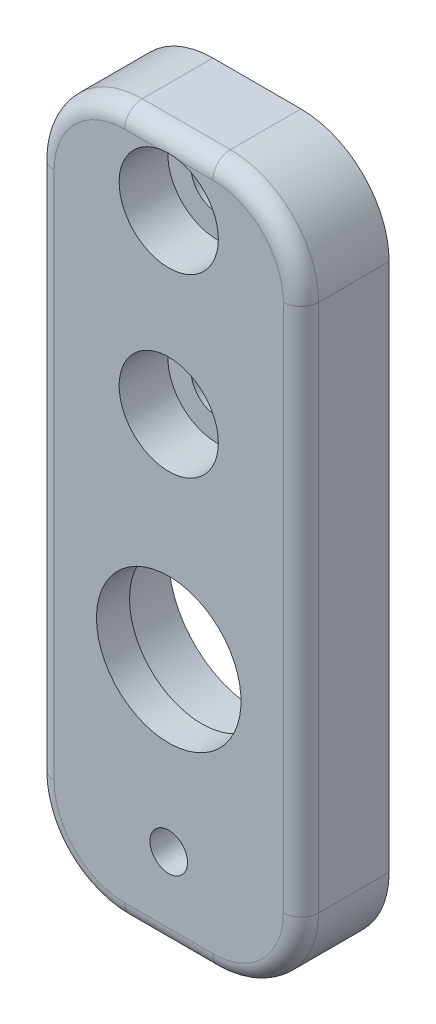
ISO-10303-21;
HEADER;
FILE_DESCRIPTION(('STEP AP214'),'2;1');
FILE_NAME('part.step','',(''),(''),'','','');
FILE_SCHEMA(('AUTOMOTIVE_DESIGN { 1 0 10303 214 1 1 1 1 }'));
ENDSEC;
DATA;
#1=APPLICATION_CONTEXT('core data for automotive mechanical design processes');
#2=APPLICATION_PROTOCOL_DEFINITION('international standard','automotive_design',2000,#1);
#3=PRODUCT_CONTEXT('',#1,'mechanical');
#4=PRODUCT('Part','Part','',(#3));
#5=PRODUCT_RELATED_PRODUCT_CATEGORY('part','',(#4));
#6=PRODUCT_DEFINITION_FORMATION('','',#4);
#7=PRODUCT_DEFINITION_CONTEXT('part definition',#1,'design');
#8=PRODUCT_DEFINITION('design','',#6,#7);
#9=PRODUCT_DEFINITION_SHAPE('','',#8);
#10=(LENGTH_UNIT() NAMED_UNIT(*) SI_UNIT(.MILLI.,.METRE.));
#11=(NAMED_UNIT(*) PLANE_ANGLE_UNIT() SI_UNIT($,.RADIAN.));
#12=(NAMED_UNIT(*) SI_UNIT($,.STERADIAN.) SOLID_ANGLE_UNIT());
#13=UNCERTAINTY_MEASURE_WITH_UNIT(LENGTH_MEASURE(1.E-05),#10,'distance_accuracy_value','');
#14=(GEOMETRIC_REPRESENTATION_CONTEXT(3) GLOBAL_UNCERTAINTY_ASSIGNED_CONTEXT((#13)) GLOBAL_UNIT_ASSIGNED_CONTEXT((#10,
#11,#12)) REPRESENTATION_CONTEXT('',''));
#15=CARTESIAN_POINT('',(0.,0.,0.));
#16=DIRECTION('',(0.,0.,1.));
#17=DIRECTION('',(1.,0.,0.));
#18=AXIS2_PLACEMENT_3D('',#15,#16,#17);
#19=CARTESIAN_POINT('',(9.525,18.034,0.));
#20=DIRECTION('',(0.,0.,-1.));
#21=DIRECTION('',(-1.,0.,0.));
#22=AXIS2_PLACEMENT_3D('',#19,#20,#21);
#23=CYLINDRICAL_SURFACE('',#22,5.207);
#24=CARTESIAN_POINT('',(9.525,18.034,0.));
#25=DIRECTION('',(0.,0.,-1.));
#26=DIRECTION('',(-1.,0.,0.));
#27=AXIS2_PLACEMENT_3D('',#24,#25,#26);
#28=CIRCLE('',#27,5.207);
#29=CARTESIAN_POINT('',(4.318,18.034,0.));
#30=VERTEX_POINT('',#29);
#31=EDGE_CURVE('E172',#30,#30,#28,.T.);
#32=ORIENTED_EDGE('',*,*,#31,.F.);
#33=EDGE_LOOP('',(#32));
#34=FACE_BOUND('',#33,.T.);
#35=CARTESIAN_POINT('',(9.525,18.034,-2.38252000000001));
#36=DIRECTION('',(0.,0.,-1.));
#37=DIRECTION('',(-1.,0.,0.));
#38=AXIS2_PLACEMENT_3D('',#35,#36,#37);
#39=CIRCLE('',#38,5.207);
#40=CARTESIAN_POINT('',(4.318,18.034,-2.38252000000001));
#41=VERTEX_POINT('',#40);
#42=EDGE_CURVE('E375',#41,#41,#39,.T.);
#43=ORIENTED_EDGE('',*,*,#42,.T.);
#44=EDGE_LOOP('',(#43));
#45=FACE_BOUND('',#44,.T.);
#46=ADVANCED_FACE('F34',(#34,#45),#23,.F.);
#47=CARTESIAN_POINT('',(19.05,0.,0.));
#48=DIRECTION('',(0.,1.,0.));
#49=DIRECTION('',(0.,0.,1.));
#50=AXIS2_PLACEMENT_3D('',#47,#48,#49);
#51=PLANE('',#50);
#52=DIRECTION('',(0.,0.,-1.));
#53=VECTOR('',#52,1.);
#54=CARTESIAN_POINT('',(12.7,0.,0.));
#55=LINE('',#54,#53);
#56=CARTESIAN_POINT('',(12.7,0.,-6.35000000000001));
#57=VERTEX_POINT('',#56);
#58=CARTESIAN_POINT('',(12.7,0.,-1.27));
#59=VERTEX_POINT('',#58);
#60=EDGE_CURVE('E209',#57,#59,#55,.F.);
#61=ORIENTED_EDGE('',*,*,#60,.T.);
#62=DIRECTION('',(-1.,0.,0.));
#63=VECTOR('',#62,1.);
#64=CARTESIAN_POINT('',(19.05,0.,-1.27));
#65=LINE('',#64,#63);
#66=CARTESIAN_POINT('',(6.35,0.,-1.27));
#67=VERTEX_POINT('',#66);
#68=EDGE_CURVE('E357',#59,#67,#65,.T.);
#69=ORIENTED_EDGE('',*,*,#68,.T.);
#70=DIRECTION('',(0.,0.,-1.));
#71=VECTOR('',#70,1.);
#72=CARTESIAN_POINT('',(6.35,0.,-6.35000000000001));
#73=LINE('',#72,#71);
#74=CARTESIAN_POINT('',(6.35,0.,-6.35000000000001));
#75=VERTEX_POINT('',#74);
#76=EDGE_CURVE('E211',#67,#75,#73,.T.);
#77=ORIENTED_EDGE('',*,*,#76,.T.);
#78=DIRECTION('',(-1.,0.,0.));
#79=VECTOR('',#78,1.);
#80=CARTESIAN_POINT('',(19.05,0.,-6.35000000000001));
#81=LINE('',#80,#79);
#82=EDGE_CURVE('E184',#57,#75,#81,.T.);
#83=ORIENTED_EDGE('',*,*,#82,.F.);
#84=EDGE_LOOP('',(#61,#69,#77,#83));
#85=FACE_BOUND('',#84,.T.);
#86=ADVANCED_FACE('F276',(#85),#51,.F.);
#87=CARTESIAN_POINT('',(19.05,50.8,-6.35));
#88=DIRECTION('',(0.,0.,1.));
#89=DIRECTION('',(0.,-1.,0.));
#90=AXIS2_PLACEMENT_3D('',#87,#88,#89);
#91=PLANE('',#90);
#92=CARTESIAN_POINT('',(9.525,18.034,-6.35000000000001));
#93=DIRECTION('',(0.,0.,-1.));
#94=DIRECTION('',(-1.,0.,0.));
#95=AXIS2_PLACEMENT_3D('',#92,#93,#94);
#96=CIRCLE('',#95,6.35);
#97=CARTESIAN_POINT('',(3.175,18.034,-6.35000000000001));
#98=VERTEX_POINT('',#97);
#99=EDGE_CURVE('E381',#98,#98,#96,.T.);
#100=ORIENTED_EDGE('',*,*,#99,.F.);
#101=EDGE_LOOP('',(#100));
#102=FACE_BOUND('',#101,.T.);
#103=CARTESIAN_POINT('',(9.52499999999999,46.0375,-6.35000000000001));
#104=DIRECTION('',(0.,0.,1.));
#105=DIRECTION('',(1.,0.,0.));
#106=AXIS2_PLACEMENT_3D('',#103,#104,#105);
#107=CIRCLE('',#106,1.89865000000001);
#108=CARTESIAN_POINT('',(11.42365,46.0375,-6.35000000000001));
#109=VERTEX_POINT('',#108);
#110=EDGE_CURVE('E157',#109,#109,#107,.T.);
#111=ORIENTED_EDGE('',*,*,#110,.T.);
#112=EDGE_LOOP('',(#111));
#113=FACE_BOUND('',#112,.T.);
#114=CARTESIAN_POINT('',(9.525,33.3375,-6.35000000000001));
#115=DIRECTION('',(0.,0.,1.));
#116=DIRECTION('',(1.,0.,0.));
#117=AXIS2_PLACEMENT_3D('',#114,#115,#116);
#118=CIRCLE('',#117,1.89865000000001);
#119=CARTESIAN_POINT('',(11.42365,33.3375,-6.35000000000001));
#120=VERTEX_POINT('',#119);
#121=EDGE_CURVE('E169',#120,#120,#118,.T.);
#122=ORIENTED_EDGE('',*,*,#121,.T.);
#123=EDGE_LOOP('',(#122));
#124=FACE_BOUND('',#123,.T.);
#125=DIRECTION('',(0.,1.,0.));
#126=VECTOR('',#125,1.);
#127=CARTESIAN_POINT('',(0.,50.8,-6.35));
#128=LINE('',#127,#126);
#129=CARTESIAN_POINT('',(0.,6.35,-6.35));
#130=VERTEX_POINT('',#129);
#131=CARTESIAN_POINT('',(0.,44.45,-6.35));
#132=VERTEX_POINT('',#131);
#133=EDGE_CURVE('E175',#130,#132,#128,.T.);
#134=ORIENTED_EDGE('',*,*,#133,.T.);
#135=CARTESIAN_POINT('',(6.35,44.45,-6.35));
#136=DIRECTION('',(0.,0.,1.));
#137=DIRECTION('',(0.,-1.,0.));
#138=AXIS2_PLACEMENT_3D('',#135,#136,#137);
#139=CIRCLE('',#138,6.35);
#140=CARTESIAN_POINT('',(6.35,50.8,-6.35));
#141=VERTEX_POINT('',#140);
#142=EDGE_CURVE('E203',#132,#141,#139,.F.);
#143=ORIENTED_EDGE('',*,*,#142,.T.);
#144=DIRECTION('',(-1.,0.,0.));
#145=VECTOR('',#144,1.);
#146=CARTESIAN_POINT('',(19.05,50.8,-6.35));
#147=LINE('',#146,#145);
#148=CARTESIAN_POINT('',(12.7,50.8,-6.35));
#149=VERTEX_POINT('',#148);
#150=EDGE_CURVE('E179',#149,#141,#147,.T.);
#151=ORIENTED_EDGE('',*,*,#150,.F.);
#152=CARTESIAN_POINT('',(12.7,44.45,-6.35));
#153=DIRECTION('',(0.,0.,1.));
#154=DIRECTION('',(0.,-1.,0.));
#155=AXIS2_PLACEMENT_3D('',#152,#153,#154);
#156=CIRCLE('',#155,6.35);
#157=CARTESIAN_POINT('',(19.05,44.45,-6.35));
#158=VERTEX_POINT('',#157);
#159=EDGE_CURVE('E201',#149,#158,#156,.F.);
#160=ORIENTED_EDGE('',*,*,#159,.T.);
#161=DIRECTION('',(0.,1.,0.));
#162=VECTOR('',#161,1.);
#163=CARTESIAN_POINT('',(19.05,50.8,-6.35));
#164=LINE('',#163,#162);
#165=CARTESIAN_POINT('',(19.05,6.35,-6.35));
#166=VERTEX_POINT('',#165);
#167=EDGE_CURVE('E176',#166,#158,#164,.T.);
#168=ORIENTED_EDGE('',*,*,#167,.F.);
#169=CARTESIAN_POINT('',(12.7,6.35,-6.35));
#170=DIRECTION('',(0.,0.,1.));
#171=DIRECTION('',(0.,-1.,0.));
#172=AXIS2_PLACEMENT_3D('',#169,#170,#171);
#173=CIRCLE('',#172,6.35);
#174=EDGE_CURVE('E197',#166,#57,#173,.F.);
#175=ORIENTED_EDGE('',*,*,#174,.T.);
#176=ORIENTED_EDGE('',*,*,#82,.T.);
#177=CARTESIAN_POINT('',(6.35,6.35,-6.35));
#178=DIRECTION('',(0.,0.,1.));
#179=DIRECTION('',(0.,-1.,0.));
#180=AXIS2_PLACEMENT_3D('',#177,#178,#179);
#181=CIRCLE('',#180,6.35);
#182=EDGE_CURVE('E199',#75,#130,#181,.F.);
#183=ORIENTED_EDGE('',*,*,#182,.T.);
#184=EDGE_LOOP('',(#134,#143,#151,#160,#168,#175,#176,#183));
#185=FACE_BOUND('',#184,.T.);
#186=ADVANCED_FACE('F291',(#102,#113,#124,#185),#91,.F.);
#187=CARTESIAN_POINT('',(19.05,50.8,0.));
#188=DIRECTION('',(0.,-1.,0.));
#189=DIRECTION('',(0.,0.,-1.));
#190=AXIS2_PLACEMENT_3D('',#187,#188,#189);
#191=PLANE('',#190);
#192=DIRECTION('',(0.,0.,1.));
#193=VECTOR('',#192,1.);
#194=CARTESIAN_POINT('',(6.35,50.8,0.));
#195=LINE('',#194,#193);
#196=CARTESIAN_POINT('',(6.35,50.8,-1.27));
#197=VERTEX_POINT('',#196);
#198=EDGE_CURVE('E189',#141,#197,#195,.T.);
#199=ORIENTED_EDGE('',*,*,#198,.T.);
#200=DIRECTION('',(-1.,0.,0.));
#201=VECTOR('',#200,1.);
#202=CARTESIAN_POINT('',(19.05,50.8,-1.27));
#203=LINE('',#202,#201);
#204=CARTESIAN_POINT('',(12.7,50.8,-1.27));
#205=VERTEX_POINT('',#204);
#206=EDGE_CURVE('E242',#197,#205,#203,.F.);
#207=ORIENTED_EDGE('',*,*,#206,.T.);
#208=DIRECTION('',(0.,0.,1.));
#209=VECTOR('',#208,1.);
#210=CARTESIAN_POINT('',(12.7,50.8,0.));
#211=LINE('',#210,#209);
#212=EDGE_CURVE('E187',#205,#149,#211,.F.);
#213=ORIENTED_EDGE('',*,*,#212,.T.);
#214=ORIENTED_EDGE('',*,*,#150,.T.);
#215=EDGE_LOOP('',(#199,#207,#213,#214));
#216=FACE_BOUND('',#215,.T.);
#217=ADVANCED_FACE('F287',(#216),#191,.F.);
#218=CARTESIAN_POINT('',(19.05,0.,0.));
#219=DIRECTION('',(0.,0.,-1.));
#220=DIRECTION('',(-1.,0.,0.));
#221=AXIS2_PLACEMENT_3D('',#218,#219,#220);
#222=PLANE('',#221);
#223=CARTESIAN_POINT('',(9.525,6.034,0.));
#224=DIRECTION('',(0.,0.,1.));
#225=DIRECTION('',(1.,0.,0.));
#226=AXIS2_PLACEMENT_3D('',#223,#224,#225);
#227=CIRCLE('',#226,1.35255);
#228=CARTESIAN_POINT('',(10.87755,6.034,0.));
#229=VERTEX_POINT('',#228);
#230=EDGE_CURVE('E142',#229,#229,#227,.T.);
#231=ORIENTED_EDGE('',*,*,#230,.F.);
#232=EDGE_LOOP('',(#231));
#233=FACE_BOUND('',#232,.T.);
#234=CARTESIAN_POINT('',(12.7,44.45,0.));
#235=DIRECTION('',(0.,0.,-1.));
#236=DIRECTION('',(-1.,0.,0.));
#237=AXIS2_PLACEMENT_3D('',#234,#235,#236);
#238=CIRCLE('',#237,5.08);
#239=CARTESIAN_POINT('',(17.78,44.45,0.));
#240=VERTEX_POINT('',#239);
#241=CARTESIAN_POINT('',(12.7,49.53,0.));
#242=VERTEX_POINT('',#241);
#243=EDGE_CURVE('E227',#240,#242,#238,.F.);
#244=ORIENTED_EDGE('',*,*,#243,.T.);
#245=DIRECTION('',(-1.,0.,0.));
#246=VECTOR('',#245,1.);
#247=CARTESIAN_POINT('',(19.05,49.53,0.));
#248=LINE('',#247,#246);
#249=CARTESIAN_POINT('',(10.2768453631565,49.53,0.));
#250=VERTEX_POINT('',#249);
#251=EDGE_CURVE('E230',#242,#250,#248,.T.);
#252=ORIENTED_EDGE('',*,*,#251,.T.);
#253=CARTESIAN_POINT('',(9.52499999999999,46.0375,0.));
#254=DIRECTION('',(0.,0.,1.));
#255=DIRECTION('',(1.,0.,0.));
#256=AXIS2_PLACEMENT_3D('',#253,#254,#255);
#257=CIRCLE('',#256,3.57250999999999);
#258=CARTESIAN_POINT('',(8.77315463684349,49.53,0.));
#259=VERTEX_POINT('',#258);
#260=EDGE_CURVE('E141',#259,#250,#257,.T.);
#261=ORIENTED_EDGE('',*,*,#260,.F.);
#262=DIRECTION('',(-1.,0.,0.));
#263=VECTOR('',#262,1.);
#264=CARTESIAN_POINT('',(19.05,49.53,0.));
#265=LINE('',#264,#263);
#266=CARTESIAN_POINT('',(6.35,49.53,0.));
#267=VERTEX_POINT('',#266);
#268=EDGE_CURVE('E225',#259,#267,#265,.T.);
#269=ORIENTED_EDGE('',*,*,#268,.T.);
#270=CARTESIAN_POINT('',(6.35,44.45,0.));
#271=DIRECTION('',(0.,0.,-1.));
#272=DIRECTION('',(-1.,0.,0.));
#273=AXIS2_PLACEMENT_3D('',#270,#271,#272);
#274=CIRCLE('',#273,5.08);
#275=CARTESIAN_POINT('',(1.27,44.45,0.));
#276=VERTEX_POINT('',#275);
#277=EDGE_CURVE('E223',#267,#276,#274,.F.);
#278=ORIENTED_EDGE('',*,*,#277,.T.);
#279=DIRECTION('',(0.,-1.,0.));
#280=VECTOR('',#279,1.);
#281=CARTESIAN_POINT('',(1.27,6.35,0.));
#282=LINE('',#281,#280);
#283=CARTESIAN_POINT('',(1.27,6.35,0.));
#284=VERTEX_POINT('',#283);
#285=EDGE_CURVE('E221',#276,#284,#282,.T.);
#286=ORIENTED_EDGE('',*,*,#285,.T.);
#287=CARTESIAN_POINT('',(6.35,6.35,0.));
#288=DIRECTION('',(0.,0.,-1.));
#289=DIRECTION('',(-1.,0.,0.));
#290=AXIS2_PLACEMENT_3D('',#287,#288,#289);
#291=CIRCLE('',#290,5.08);
#292=CARTESIAN_POINT('',(6.35,1.27,0.));
#293=VERTEX_POINT('',#292);
#294=EDGE_CURVE('E219',#284,#293,#291,.F.);
#295=ORIENTED_EDGE('',*,*,#294,.T.);
#296=DIRECTION('',(-1.,0.,0.));
#297=VECTOR('',#296,1.);
#298=CARTESIAN_POINT('',(19.05,1.27,0.));
#299=LINE('',#298,#297);
#300=CARTESIAN_POINT('',(12.7,1.27,0.));
#301=VERTEX_POINT('',#300);
#302=EDGE_CURVE('E217',#293,#301,#299,.F.);
#303=ORIENTED_EDGE('',*,*,#302,.T.);
#304=CARTESIAN_POINT('',(12.7,6.35,0.));
#305=DIRECTION('',(0.,0.,-1.));
#306=DIRECTION('',(-1.,0.,0.));
#307=AXIS2_PLACEMENT_3D('',#304,#305,#306);
#308=CIRCLE('',#307,5.08);
#309=CARTESIAN_POINT('',(17.78,6.35,0.));
#310=VERTEX_POINT('',#309);
#311=EDGE_CURVE('E215',#301,#310,#308,.F.);
#312=ORIENTED_EDGE('',*,*,#311,.T.);
#313=DIRECTION('',(0.,-1.,0.));
#314=VECTOR('',#313,1.);
#315=CARTESIAN_POINT('',(17.78,0.,0.));
#316=LINE('',#315,#314);
#317=EDGE_CURVE('E213',#310,#240,#316,.F.);
#318=ORIENTED_EDGE('',*,*,#317,.T.);
#319=EDGE_LOOP('',(#244,#252,#261,#269,#278,#286,#295,#303,#312,#318));
#320=FACE_BOUND('',#319,.T.);
#321=CARTESIAN_POINT('',(9.525,33.3375,0.));
#322=DIRECTION('',(0.,0.,1.));
#323=DIRECTION('',(1.,0.,0.));
#324=AXIS2_PLACEMENT_3D('',#321,#322,#323);
#325=CIRCLE('',#324,3.57250999999999);
#326=CARTESIAN_POINT('',(13.09751,33.3375,0.));
#327=VERTEX_POINT('',#326);
#328=EDGE_CURVE('E160',#327,#327,#325,.T.);
#329=ORIENTED_EDGE('',*,*,#328,.F.);
#330=EDGE_LOOP('',(#329));
#331=FACE_BOUND('',#330,.T.);
#332=ORIENTED_EDGE('',*,*,#31,.T.);
#333=EDGE_LOOP('',(#332));
#334=FACE_BOUND('',#333,.T.);
#335=ADVANCED_FACE('F281',(#233,#320,#331,#334),#222,.F.);
#336=CARTESIAN_POINT('',(19.05,0.,-6.35000000000001));
#337=DIRECTION('',(-1.,0.,0.));
#338=DIRECTION('',(0.,0.,1.));
#339=AXIS2_PLACEMENT_3D('',#336,#337,#338);
#340=PLANE('',#339);
#341=DIRECTION('',(0.,0.,1.));
#342=VECTOR('',#341,1.);
#343=CARTESIAN_POINT('',(19.05,44.45,-6.35000000000001));
#344=LINE('',#343,#342);
#345=CARTESIAN_POINT('',(19.05,44.45,-1.27));
#346=VERTEX_POINT('',#345);
#347=EDGE_CURVE('E207',#158,#346,#344,.T.);
#348=ORIENTED_EDGE('',*,*,#347,.T.);
#349=DIRECTION('',(0.,-1.,0.));
#350=VECTOR('',#349,1.);
#351=CARTESIAN_POINT('',(19.05,0.,-1.27));
#352=LINE('',#351,#350);
#353=CARTESIAN_POINT('',(19.05,6.35,-1.27));
#354=VERTEX_POINT('',#353);
#355=EDGE_CURVE('E11',#346,#354,#352,.T.);
#356=ORIENTED_EDGE('',*,*,#355,.T.);
#357=DIRECTION('',(0.,0.,-1.));
#358=VECTOR('',#357,1.);
#359=CARTESIAN_POINT('',(19.05,6.35,-6.35000000000001));
#360=LINE('',#359,#358);
#361=EDGE_CURVE('E205',#354,#166,#360,.T.);
#362=ORIENTED_EDGE('',*,*,#361,.T.);
#363=ORIENTED_EDGE('',*,*,#167,.T.);
#364=EDGE_LOOP('',(#348,#356,#362,#363));
#365=FACE_BOUND('',#364,.T.);
#366=ADVANCED_FACE('F278',(#365),#340,.F.);
#367=CARTESIAN_POINT('',(0.,0.,-6.35000000000001));
#368=DIRECTION('',(-1.,0.,0.));
#369=DIRECTION('',(0.,0.,1.));
#370=AXIS2_PLACEMENT_3D('',#367,#368,#369);
#371=PLANE('',#370);
#372=DIRECTION('',(0.,0.,-1.));
#373=VECTOR('',#372,1.);
#374=CARTESIAN_POINT('',(0.,6.35,0.));
#375=LINE('',#374,#373);
#376=CARTESIAN_POINT('',(0.,6.35,-1.27));
#377=VERTEX_POINT('',#376);
#378=EDGE_CURVE('E192',#130,#377,#375,.F.);
#379=ORIENTED_EDGE('',*,*,#378,.T.);
#380=DIRECTION('',(0.,-1.,0.));
#381=VECTOR('',#380,1.);
#382=CARTESIAN_POINT('',(0.,44.45,-1.27));
#383=LINE('',#382,#381);
#384=CARTESIAN_POINT('',(0.,44.45,-1.27));
#385=VERTEX_POINT('',#384);
#386=EDGE_CURVE('E352',#377,#385,#383,.F.);
#387=ORIENTED_EDGE('',*,*,#386,.T.);
#388=DIRECTION('',(0.,0.,1.));
#389=VECTOR('',#388,1.);
#390=CARTESIAN_POINT('',(0.,44.45,-6.35));
#391=LINE('',#390,#389);
#392=EDGE_CURVE('E195',#385,#132,#391,.F.);
#393=ORIENTED_EDGE('',*,*,#392,.T.);
#394=ORIENTED_EDGE('',*,*,#133,.F.);
#395=EDGE_LOOP('',(#379,#387,#393,#394));
#396=FACE_BOUND('',#395,.T.);
#397=ADVANCED_FACE('F272',(#396),#371,.T.);
#398=CARTESIAN_POINT('',(9.525,33.3375,0.));
#399=DIRECTION('',(0.,0.,1.));
#400=DIRECTION('',(1.,0.,0.));
#401=AXIS2_PLACEMENT_3D('',#398,#399,#400);
#402=CYLINDRICAL_SURFACE('',#401,1.89865);
#403=ORIENTED_EDGE('',*,*,#121,.F.);
#404=EDGE_LOOP('',(#403));
#405=FACE_BOUND('',#404,.T.);
#406=CARTESIAN_POINT('',(9.525,33.3375,-3.5052));
#407=DIRECTION('',(0.,0.,1.));
#408=DIRECTION('',(1.,0.,0.));
#409=AXIS2_PLACEMENT_3D('',#406,#407,#408);
#410=CIRCLE('',#409,1.89865);
#411=CARTESIAN_POINT('',(11.42365,33.3375,-3.5052));
#412=VERTEX_POINT('',#411);
#413=EDGE_CURVE('E166',#412,#412,#410,.T.);
#414=ORIENTED_EDGE('',*,*,#413,.T.);
#415=EDGE_LOOP('',(#414));
#416=FACE_BOUND('',#415,.T.);
#417=ADVANCED_FACE('F268',(#405,#416),#402,.F.);
#418=CARTESIAN_POINT('',(11.42365,33.3375,-3.5052));
#419=DIRECTION('',(0.,0.,-1.));
#420=DIRECTION('',(-1.,0.,0.));
#421=AXIS2_PLACEMENT_3D('',#418,#419,#420);
#422=PLANE('',#421);
#423=ORIENTED_EDGE('',*,*,#413,.F.);
#424=EDGE_LOOP('',(#423));
#425=FACE_BOUND('',#424,.T.);
#426=CARTESIAN_POINT('',(9.525,33.3375,-3.5052));
#427=DIRECTION('',(0.,0.,1.));
#428=DIRECTION('',(1.,0.,0.));
#429=AXIS2_PLACEMENT_3D('',#426,#427,#428);
#430=CIRCLE('',#429,3.57251);
#431=CARTESIAN_POINT('',(13.09751,33.3375,-3.5052));
#432=VERTEX_POINT('',#431);
#433=EDGE_CURVE('E163',#432,#432,#430,.T.);
#434=ORIENTED_EDGE('',*,*,#433,.T.);
#435=EDGE_LOOP('',(#434));
#436=FACE_BOUND('',#435,.T.);
#437=ADVANCED_FACE('F264',(#425,#436),#422,.F.);
#438=CARTESIAN_POINT('',(9.525,33.3375,0.));
#439=DIRECTION('',(0.,0.,1.));
#440=DIRECTION('',(1.,0.,0.));
#441=AXIS2_PLACEMENT_3D('',#438,#439,#440);
#442=CYLINDRICAL_SURFACE('',#441,3.57251);
#443=ORIENTED_EDGE('',*,*,#433,.F.);
#444=EDGE_LOOP('',(#443));
#445=FACE_BOUND('',#444,.T.);
#446=ORIENTED_EDGE('',*,*,#328,.T.);
#447=EDGE_LOOP('',(#446));
#448=FACE_BOUND('',#447,.T.);
#449=ADVANCED_FACE('F260',(#445,#448),#442,.F.);
#450=CARTESIAN_POINT('',(9.52499999999999,46.0375,0.));
#451=DIRECTION('',(0.,0.,1.));
#452=DIRECTION('',(1.,0.,0.));
#453=AXIS2_PLACEMENT_3D('',#450,#451,#452);
#454=CYLINDRICAL_SURFACE('',#453,1.89865);
#455=ORIENTED_EDGE('',*,*,#110,.F.);
#456=EDGE_LOOP('',(#455));
#457=FACE_BOUND('',#456,.T.);
#458=CARTESIAN_POINT('',(9.52499999999999,46.0375,-3.5052));
#459=DIRECTION('',(0.,0.,1.));
#460=DIRECTION('',(1.,0.,0.));
#461=AXIS2_PLACEMENT_3D('',#458,#459,#460);
#462=CIRCLE('',#461,1.89865);
#463=CARTESIAN_POINT('',(11.42365,46.0375,-3.5052));
#464=VERTEX_POINT('',#463);
#465=EDGE_CURVE('E154',#464,#464,#462,.T.);
#466=ORIENTED_EDGE('',*,*,#465,.T.);
#467=EDGE_LOOP('',(#466));
#468=FACE_BOUND('',#467,.T.);
#469=ADVANCED_FACE('F256',(#457,#468),#454,.F.);
#470=CARTESIAN_POINT('',(11.42365,46.0375,-3.5052));
#471=DIRECTION('',(0.,0.,-1.));
#472=DIRECTION('',(-1.,0.,0.));
#473=AXIS2_PLACEMENT_3D('',#470,#471,#472);
#474=PLANE('',#473);
#475=ORIENTED_EDGE('',*,*,#465,.F.);
#476=EDGE_LOOP('',(#475));
#477=FACE_BOUND('',#476,.T.);
#478=CARTESIAN_POINT('',(9.52499999999999,46.0375,-3.5052));
#479=DIRECTION('',(0.,0.,1.));
#480=DIRECTION('',(1.,0.,0.));
#481=AXIS2_PLACEMENT_3D('',#478,#479,#480);
#482=CIRCLE('',#481,3.57251);
#483=CARTESIAN_POINT('',(13.09751,46.0375,-3.5052));
#484=VERTEX_POINT('',#483);
#485=EDGE_CURVE('E145',#484,#484,#482,.T.);
#486=ORIENTED_EDGE('',*,*,#485,.T.);
#487=EDGE_LOOP('',(#486));
#488=FACE_BOUND('',#487,.T.);
#489=ADVANCED_FACE('F251',(#477,#488),#474,.F.);
#490=CARTESIAN_POINT('',(9.52499999999999,46.0375,0.));
#491=DIRECTION('',(0.,0.,1.));
#492=DIRECTION('',(1.,0.,0.));
#493=AXIS2_PLACEMENT_3D('',#490,#491,#492);
#494=CYLINDRICAL_SURFACE('',#493,3.57251);
#495=ORIENTED_EDGE('',*,*,#485,.F.);
#496=EDGE_LOOP('',(#495));
#497=FACE_BOUND('',#496,.T.);
#498=ORIENTED_EDGE('',*,*,#260,.T.);
#499=CARTESIAN_POINT('',(10.2768453631565,49.53,0.));
#500=CARTESIAN_POINT('',(10.2273521218033,49.5406545092437,-3.92462751238458E-06));
#501=CARTESIAN_POINT('',(10.177639156777,49.5502555193637,-0.00013349214971235));
#502=CARTESIAN_POINT('',(10.0778502353875,49.5673367679829,-0.00051951923269982));
#503=CARTESIAN_POINT('',(10.0277742761021,49.5748169893896,-0.000775979816136989));
#504=CARTESIAN_POINT('',(9.87708716873082,49.5940594888495,-0.00154926005581477));
#505=CARTESIAN_POINT('',(9.77604706943469,49.6026170869488,-0.00206982407637424));
#506=CARTESIAN_POINT('',(9.57539182559674,49.611041634885,-0.00258225613781227));
#507=CARTESIAN_POINT('',(9.47578265681987,49.6110579267881,-0.00258320942161197));
#508=CARTESIAN_POINT('',(9.27696159657266,49.6027759998469,-0.00207951103605163));
#509=CARTESIAN_POINT('',(9.17774948733159,49.5944832360082,-0.00157519108530436));
#510=CARTESIAN_POINT('',(9.0278612699974,49.5756277723678,-0.000804601671630059));
#511=CARTESIAN_POINT('',(8.97678920064301,49.5680746692043,-0.000540489043507389));
#512=CARTESIAN_POINT('',(8.87478482386265,49.550723030334,-0.000140150899497991));
#513=CARTESIAN_POINT('',(8.8238542503645,49.5409142886161,-4.52145979865636E-06));
#514=CARTESIAN_POINT('',(8.77315463684348,49.53,0.));
#515=B_SPLINE_CURVE_WITH_KNOTS('',3,(#499,#500,#501,#502,#503,#504,#505,#506,#507,#508,#509,
#510,#511,#512,#513,#514),.UNSPECIFIED.,.F.,.F.,(4,2,2,2,2,2,2,4),(0.,0.151856088059579,
0.303713399969426,0.607520636776616,0.906015718785188,1.2043149631217,1.35915744326305,
1.51471482089773),.UNSPECIFIED.);
#516=EDGE_CURVE('E235',#250,#259,#515,.T.);
#517=ORIENTED_EDGE('',*,*,#516,.T.);
#518=EDGE_LOOP('',(#498,#517));
#519=FACE_BOUND('',#518,.T.);
#520=ADVANCED_FACE('F135',(#497,#519),#494,.F.);
#521=CARTESIAN_POINT('',(9.525,6.034,-5.08));
#522=DIRECTION('',(0.,0.,1.));
#523=DIRECTION('',(1.,0.,0.));
#524=AXIS2_PLACEMENT_3D('',#521,#522,#523);
#525=CONICAL_SURFACE('',#524,1.35255,1.02974425867665);
#526=CARTESIAN_POINT('',(9.525,6.034,-5.89269403026573));
#527=VERTEX_POINT('',#526);
#528=VERTEX_LOOP('',#527);
#529=FACE_BOUND('',#528,.T.);
#530=CARTESIAN_POINT('',(9.525,6.034,-5.08));
#531=DIRECTION('',(0.,0.,1.));
#532=DIRECTION('',(1.,0.,0.));
#533=AXIS2_PLACEMENT_3D('',#530,#531,#532);
#534=CIRCLE('',#533,1.35255);
#535=CARTESIAN_POINT('',(10.87755,6.034,-5.08));
#536=VERTEX_POINT('',#535);
#537=EDGE_CURVE('E139',#536,#536,#534,.T.);
#538=ORIENTED_EDGE('',*,*,#537,.T.);
#539=EDGE_LOOP('',(#538));
#540=FACE_BOUND('',#539,.T.);
#541=ADVANCED_FACE('F131',(#529,#540),#525,.F.);
#542=CARTESIAN_POINT('',(9.525,6.034,0.));
#543=DIRECTION('',(0.,0.,1.));
#544=DIRECTION('',(1.,0.,0.));
#545=AXIS2_PLACEMENT_3D('',#542,#543,#544);
#546=CYLINDRICAL_SURFACE('',#545,1.35255);
#547=ORIENTED_EDGE('',*,*,#537,.F.);
#548=EDGE_LOOP('',(#547));
#549=FACE_BOUND('',#548,.T.);
#550=ORIENTED_EDGE('',*,*,#230,.T.);
#551=EDGE_LOOP('',(#550));
#552=FACE_BOUND('',#551,.T.);
#553=ADVANCED_FACE('F134',(#549,#552),#546,.F.);
#554=CARTESIAN_POINT('',(9.525,18.034,-2.38252000000001));
#555=DIRECTION('',(0.,0.,-1.));
#556=DIRECTION('',(-1.,0.,0.));
#557=AXIS2_PLACEMENT_3D('',#554,#555,#556);
#558=CYLINDRICAL_SURFACE('',#557,6.35);
#559=CARTESIAN_POINT('',(9.525,18.034,-2.38252000000001));
#560=DIRECTION('',(0.,0.,-1.));
#561=DIRECTION('',(-1.,0.,0.));
#562=AXIS2_PLACEMENT_3D('',#559,#560,#561);
#563=CIRCLE('',#562,6.35);
#564=CARTESIAN_POINT('',(3.175,18.034,-2.38252000000001));
#565=VERTEX_POINT('',#564);
#566=EDGE_CURVE('E148',#565,#565,#563,.T.);
#567=ORIENTED_EDGE('',*,*,#566,.F.);
#568=EDGE_LOOP('',(#567));
#569=FACE_BOUND('',#568,.T.);
#570=ORIENTED_EDGE('',*,*,#99,.T.);
#571=EDGE_LOOP('',(#570));
#572=FACE_BOUND('',#571,.T.);
#573=ADVANCED_FACE('F391',(#569,#572),#558,.F.);
#574=CARTESIAN_POINT('',(9.525,18.034,-2.38252000000001));
#575=DIRECTION('',(0.,0.,-1.));
#576=DIRECTION('',(-1.,0.,0.));
#577=AXIS2_PLACEMENT_3D('',#574,#575,#576);
#578=PLANE('',#577);
#579=ORIENTED_EDGE('',*,*,#42,.F.);
#580=EDGE_LOOP('',(#579));
#581=FACE_BOUND('',#580,.T.);
#582=ORIENTED_EDGE('',*,*,#566,.T.);
#583=EDGE_LOOP('',(#582));
#584=FACE_BOUND('',#583,.T.);
#585=ADVANCED_FACE('F303',(#581,#584),#578,.T.);
#586=CARTESIAN_POINT('',(6.35,44.45,0.));
#587=DIRECTION('',(0.,0.,-1.));
#588=DIRECTION('',(-1.,0.,0.));
#589=AXIS2_PLACEMENT_3D('',#586,#587,#588);
#590=CYLINDRICAL_SURFACE('',#589,6.35);
#591=ORIENTED_EDGE('',*,*,#392,.F.);
#592=CARTESIAN_POINT('',(6.35,44.45,-1.27));
#593=DIRECTION('',(0.,0.,-1.));
#594=DIRECTION('',(-1.,0.,0.));
#595=AXIS2_PLACEMENT_3D('',#592,#593,#594);
#596=CIRCLE('',#595,6.35);
#597=EDGE_CURVE('E348',#385,#197,#596,.T.);
#598=ORIENTED_EDGE('',*,*,#597,.T.);
#599=ORIENTED_EDGE('',*,*,#198,.F.);
#600=ORIENTED_EDGE('',*,*,#142,.F.);
#601=EDGE_LOOP('',(#591,#598,#599,#600));
#602=FACE_BOUND('',#601,.T.);
#603=ADVANCED_FACE('F299',(#602),#590,.T.);
#604=CARTESIAN_POINT('',(12.7,44.45,-6.35000000000001));
#605=DIRECTION('',(0.,0.,1.));
#606=DIRECTION('',(1.,0.,0.));
#607=AXIS2_PLACEMENT_3D('',#604,#605,#606);
#608=CYLINDRICAL_SURFACE('',#607,6.35);
#609=ORIENTED_EDGE('',*,*,#212,.F.);
#610=CARTESIAN_POINT('',(12.7,44.45,-1.27));
#611=DIRECTION('',(0.,0.,-1.));
#612=DIRECTION('',(-1.,0.,0.));
#613=AXIS2_PLACEMENT_3D('',#610,#611,#612);
#614=CIRCLE('',#613,6.35);
#615=EDGE_CURVE('E232',#205,#346,#614,.T.);
#616=ORIENTED_EDGE('',*,*,#615,.T.);
#617=ORIENTED_EDGE('',*,*,#347,.F.);
#618=ORIENTED_EDGE('',*,*,#159,.F.);
#619=EDGE_LOOP('',(#609,#616,#617,#618));
#620=FACE_BOUND('',#619,.T.);
#621=ADVANCED_FACE('F302',(#620),#608,.T.);
#622=CARTESIAN_POINT('',(6.35,6.35,0.));
#623=DIRECTION('',(0.,0.,1.));
#624=DIRECTION('',(1.,0.,0.));
#625=AXIS2_PLACEMENT_3D('',#622,#623,#624);
#626=CYLINDRICAL_SURFACE('',#625,6.35);
#627=ORIENTED_EDGE('',*,*,#76,.F.);
#628=CARTESIAN_POINT('',(6.35,6.35,-1.27));
#629=DIRECTION('',(0.,0.,-1.));
#630=DIRECTION('',(-1.,0.,0.));
#631=AXIS2_PLACEMENT_3D('',#628,#629,#630);
#632=CIRCLE('',#631,6.35);
#633=EDGE_CURVE('E353',#67,#377,#632,.T.);
#634=ORIENTED_EDGE('',*,*,#633,.T.);
#635=ORIENTED_EDGE('',*,*,#378,.F.);
#636=ORIENTED_EDGE('',*,*,#182,.F.);
#637=EDGE_LOOP('',(#627,#634,#635,#636));
#638=FACE_BOUND('',#637,.T.);
#639=ADVANCED_FACE('F307',(#638),#626,.T.);
#640=CARTESIAN_POINT('',(12.7,6.35,-6.35000000000001));
#641=DIRECTION('',(0.,0.,-1.));
#642=DIRECTION('',(-1.,0.,0.));
#643=AXIS2_PLACEMENT_3D('',#640,#641,#642);
#644=CYLINDRICAL_SURFACE('',#643,6.35);
#645=ORIENTED_EDGE('',*,*,#361,.F.);
#646=CARTESIAN_POINT('',(12.7,6.35,-1.27));
#647=DIRECTION('',(0.,0.,-1.));
#648=DIRECTION('',(-1.,0.,0.));
#649=AXIS2_PLACEMENT_3D('',#646,#647,#648);
#650=CIRCLE('',#649,6.35);
#651=EDGE_CURVE('E43',#354,#59,#650,.T.);
#652=ORIENTED_EDGE('',*,*,#651,.T.);
#653=ORIENTED_EDGE('',*,*,#60,.F.);
#654=ORIENTED_EDGE('',*,*,#174,.F.);
#655=EDGE_LOOP('',(#645,#652,#653,#654));
#656=FACE_BOUND('',#655,.T.);
#657=ADVANCED_FACE('F311',(#656),#644,.T.);
#658=CARTESIAN_POINT('',(6.35,6.35,-1.27));
#659=DIRECTION('',(0.,0.,-1.));
#660=DIRECTION('',(-1.,0.,0.));
#661=AXIS2_PLACEMENT_3D('',#658,#659,#660);
#662=TOROIDAL_SURFACE('',#661,5.08,1.27);
#663=CARTESIAN_POINT('',(1.27,6.35,-1.27));
#664=DIRECTION('',(0.,1.,0.));
#665=DIRECTION('',(0.,0.,1.));
#666=AXIS2_PLACEMENT_3D('',#663,#664,#665);
#667=CIRCLE('',#666,1.27);
#668=EDGE_CURVE('E368',#377,#284,#667,.T.);
#669=ORIENTED_EDGE('',*,*,#668,.F.);
#670=ORIENTED_EDGE('',*,*,#633,.F.);
#671=CARTESIAN_POINT('',(6.35,1.27,-1.27));
#672=DIRECTION('',(1.,0.,0.));
#673=DIRECTION('',(0.,0.,-1.));
#674=AXIS2_PLACEMENT_3D('',#671,#672,#673);
#675=CIRCLE('',#674,1.27);
#676=EDGE_CURVE('E38',#293,#67,#675,.T.);
#677=ORIENTED_EDGE('',*,*,#676,.F.);
#678=ORIENTED_EDGE('',*,*,#294,.F.);
#679=EDGE_LOOP('',(#669,#670,#677,#678));
#680=FACE_BOUND('',#679,.T.);
#681=ADVANCED_FACE('F36',(#680),#662,.T.);
#682=CARTESIAN_POINT('',(19.05,1.27,-1.27));
#683=DIRECTION('',(-1.,0.,0.));
#684=DIRECTION('',(0.,0.,1.));
#685=AXIS2_PLACEMENT_3D('',#682,#683,#684);
#686=CYLINDRICAL_SURFACE('',#685,1.27);
#687=ORIENTED_EDGE('',*,*,#676,.T.);
#688=ORIENTED_EDGE('',*,*,#68,.F.);
#689=CARTESIAN_POINT('',(12.7,1.27,-1.27));
#690=DIRECTION('',(1.,0.,0.));
#691=DIRECTION('',(0.,0.,-1.));
#692=AXIS2_PLACEMENT_3D('',#689,#690,#691);
#693=CIRCLE('',#692,1.27);
#694=EDGE_CURVE('E366',#301,#59,#693,.T.);
#695=ORIENTED_EDGE('',*,*,#694,.F.);
#696=ORIENTED_EDGE('',*,*,#302,.F.);
#697=EDGE_LOOP('',(#687,#688,#695,#696));
#698=FACE_BOUND('',#697,.T.);
#699=ADVANCED_FACE('F427',(#698),#686,.T.);
#700=CARTESIAN_POINT('',(1.27,0.,-1.27));
#701=DIRECTION('',(0.,1.,0.));
#702=DIRECTION('',(0.,0.,1.));
#703=AXIS2_PLACEMENT_3D('',#700,#701,#702);
#704=CYLINDRICAL_SURFACE('',#703,1.27);
#705=ORIENTED_EDGE('',*,*,#668,.T.);
#706=ORIENTED_EDGE('',*,*,#285,.F.);
#707=CARTESIAN_POINT('',(1.27,44.45,-1.27));
#708=DIRECTION('',(0.,1.,0.));
#709=DIRECTION('',(0.,0.,1.));
#710=AXIS2_PLACEMENT_3D('',#707,#708,#709);
#711=CIRCLE('',#710,1.27);
#712=EDGE_CURVE('E364',#385,#276,#711,.T.);
#713=ORIENTED_EDGE('',*,*,#712,.F.);
#714=ORIENTED_EDGE('',*,*,#386,.F.);
#715=EDGE_LOOP('',(#705,#706,#713,#714));
#716=FACE_BOUND('',#715,.T.);
#717=ADVANCED_FACE('F422',(#716),#704,.T.);
#718=CARTESIAN_POINT('',(12.7,6.35,-1.27));
#719=DIRECTION('',(0.,0.,-1.));
#720=DIRECTION('',(-1.,0.,0.));
#721=AXIS2_PLACEMENT_3D('',#718,#719,#720);
#722=TOROIDAL_SURFACE('',#721,5.08,1.27);
#723=ORIENTED_EDGE('',*,*,#694,.T.);
#724=ORIENTED_EDGE('',*,*,#651,.F.);
#725=CARTESIAN_POINT('',(17.78,6.35,-1.27));
#726=DIRECTION('',(0.,1.,0.));
#727=DIRECTION('',(0.,0.,1.));
#728=AXIS2_PLACEMENT_3D('',#725,#726,#727);
#729=CIRCLE('',#728,1.27);
#730=EDGE_CURVE('E334',#310,#354,#729,.T.);
#731=ORIENTED_EDGE('',*,*,#730,.F.);
#732=ORIENTED_EDGE('',*,*,#311,.F.);
#733=EDGE_LOOP('',(#723,#724,#731,#732));
#734=FACE_BOUND('',#733,.T.);
#735=ADVANCED_FACE('F430',(#734),#722,.T.);
#736=CARTESIAN_POINT('',(6.35,44.45,-1.27));
#737=DIRECTION('',(0.,0.,-1.));
#738=DIRECTION('',(-1.,0.,0.));
#739=AXIS2_PLACEMENT_3D('',#736,#737,#738);
#740=TOROIDAL_SURFACE('',#739,5.08,1.27);
#741=ORIENTED_EDGE('',*,*,#712,.T.);
#742=ORIENTED_EDGE('',*,*,#277,.F.);
#743=CARTESIAN_POINT('',(6.35,49.53,-1.27));
#744=DIRECTION('',(1.,0.,0.));
#745=DIRECTION('',(0.,0.,-1.));
#746=AXIS2_PLACEMENT_3D('',#743,#744,#745);
#747=CIRCLE('',#746,1.27);
#748=EDGE_CURVE('E329',#197,#267,#747,.T.);
#749=ORIENTED_EDGE('',*,*,#748,.F.);
#750=ORIENTED_EDGE('',*,*,#597,.F.);
#751=EDGE_LOOP('',(#741,#742,#749,#750));
#752=FACE_BOUND('',#751,.T.);
#753=ADVANCED_FACE('F421',(#752),#740,.T.);
#754=CARTESIAN_POINT('',(17.78,0.,-1.27));
#755=DIRECTION('',(0.,-1.,0.));
#756=DIRECTION('',(0.,0.,-1.));
#757=AXIS2_PLACEMENT_3D('',#754,#755,#756);
#758=CYLINDRICAL_SURFACE('',#757,1.27);
#759=ORIENTED_EDGE('',*,*,#730,.T.);
#760=ORIENTED_EDGE('',*,*,#355,.F.);
#761=CARTESIAN_POINT('',(17.78,44.45,-1.27));
#762=DIRECTION('',(0.,1.,0.));
#763=DIRECTION('',(0.,0.,1.));
#764=AXIS2_PLACEMENT_3D('',#761,#762,#763);
#765=CIRCLE('',#764,1.27);
#766=EDGE_CURVE('E325',#240,#346,#765,.T.);
#767=ORIENTED_EDGE('',*,*,#766,.F.);
#768=ORIENTED_EDGE('',*,*,#317,.F.);
#769=EDGE_LOOP('',(#759,#760,#767,#768));
#770=FACE_BOUND('',#769,.T.);
#771=ADVANCED_FACE('F320',(#770),#758,.T.);
#772=CARTESIAN_POINT('',(19.05,49.53,-1.27));
#773=DIRECTION('',(-1.,0.,0.));
#774=DIRECTION('',(0.,0.,1.));
#775=AXIS2_PLACEMENT_3D('',#772,#773,#774);
#776=CYLINDRICAL_SURFACE('',#775,1.27);
#777=ORIENTED_EDGE('',*,*,#516,.F.);
#778=ORIENTED_EDGE('',*,*,#251,.F.);
#779=CARTESIAN_POINT('',(12.7,49.53,-1.27));
#780=DIRECTION('',(1.,0.,0.));
#781=DIRECTION('',(0.,0.,-1.));
#782=AXIS2_PLACEMENT_3D('',#779,#780,#781);
#783=CIRCLE('',#782,1.27);
#784=EDGE_CURVE('E330',#205,#242,#783,.T.);
#785=ORIENTED_EDGE('',*,*,#784,.F.);
#786=ORIENTED_EDGE('',*,*,#206,.F.);
#787=ORIENTED_EDGE('',*,*,#748,.T.);
#788=ORIENTED_EDGE('',*,*,#268,.F.);
#789=EDGE_LOOP('',(#777,#778,#785,#786,#787,#788));
#790=FACE_BOUND('',#789,.T.);
#791=ADVANCED_FACE('F244',(#790),#776,.T.);
#792=CARTESIAN_POINT('',(12.7,44.45,-1.27));
#793=DIRECTION('',(0.,0.,-1.));
#794=DIRECTION('',(-1.,0.,0.));
#795=AXIS2_PLACEMENT_3D('',#792,#793,#794);
#796=TOROIDAL_SURFACE('',#795,5.08,1.27);
#797=ORIENTED_EDGE('',*,*,#766,.T.);
#798=ORIENTED_EDGE('',*,*,#615,.F.);
#799=ORIENTED_EDGE('',*,*,#784,.T.);
#800=ORIENTED_EDGE('',*,*,#243,.F.);
#801=EDGE_LOOP('',(#797,#798,#799,#800));
#802=FACE_BOUND('',#801,.T.);
#803=ADVANCED_FACE('F314',(#802),#796,.T.);
#804=CLOSED_SHELL('',(#46,#86,#186,#217,#335,#366,#397,#417,#437,#449,#469,#489,#520,#541,#553,
#573,#585,#603,#621,#639,#657,#681,#699,#717,#735,#753,#771,#791,#803));
#805=MANIFOLD_SOLID_BREP('B2',#804);
#806=ADVANCED_BREP_SHAPE_REPRESENTATION('',(#18,#805),#14);
#807=SHAPE_DEFINITION_REPRESENTATION(#9,#806);
ENDSEC;
END-ISO-10303-21;
